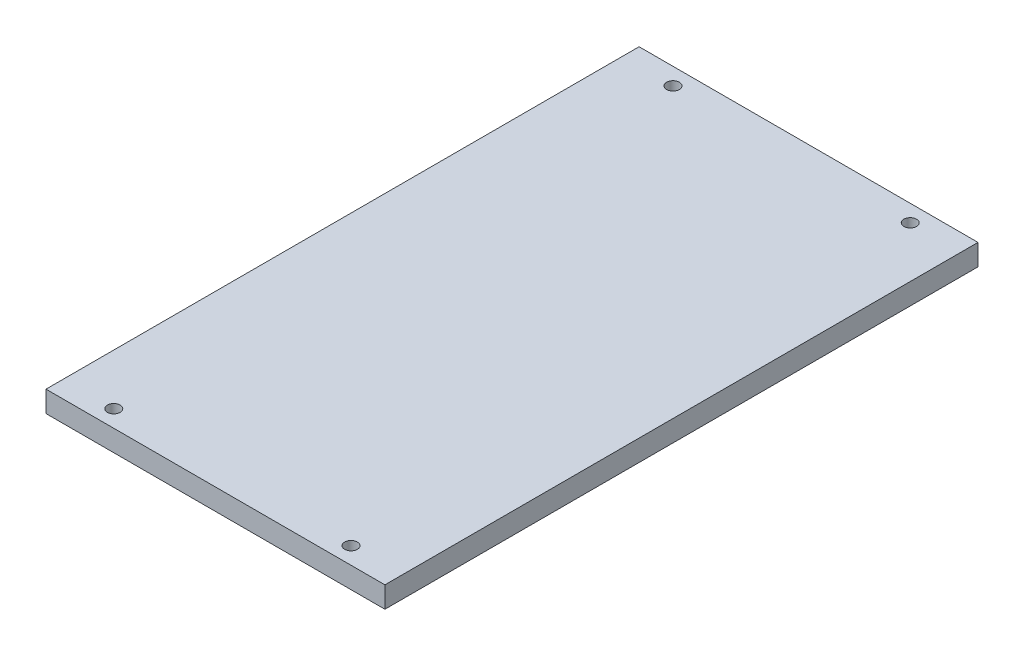
ISO-10303-21;
HEADER;
FILE_DESCRIPTION(('STEP AP214'),'2;1');
FILE_NAME('part.step','',(''),(''),'','','');
FILE_SCHEMA(('AUTOMOTIVE_DESIGN { 1 0 10303 214 1 1 1 1 }'));
ENDSEC;
DATA;
#1=APPLICATION_CONTEXT('core data for automotive mechanical design processes');
#2=APPLICATION_PROTOCOL_DEFINITION('international standard','automotive_design',2000,#1);
#3=PRODUCT_CONTEXT('',#1,'mechanical');
#4=PRODUCT('Part','Part','',(#3));
#5=PRODUCT_RELATED_PRODUCT_CATEGORY('part','',(#4));
#6=PRODUCT_DEFINITION_FORMATION('','',#4);
#7=PRODUCT_DEFINITION_CONTEXT('part definition',#1,'design');
#8=PRODUCT_DEFINITION('design','',#6,#7);
#9=PRODUCT_DEFINITION_SHAPE('','',#8);
#10=(LENGTH_UNIT() NAMED_UNIT(*) SI_UNIT(.MILLI.,.METRE.));
#11=(NAMED_UNIT(*) PLANE_ANGLE_UNIT() SI_UNIT($,.RADIAN.));
#12=(NAMED_UNIT(*) SI_UNIT($,.STERADIAN.) SOLID_ANGLE_UNIT());
#13=UNCERTAINTY_MEASURE_WITH_UNIT(LENGTH_MEASURE(1.E-05),#10,'distance_accuracy_value','');
#14=(GEOMETRIC_REPRESENTATION_CONTEXT(3) GLOBAL_UNCERTAINTY_ASSIGNED_CONTEXT((#13)) GLOBAL_UNIT_ASSIGNED_CONTEXT((#10,
#11,#12)) REPRESENTATION_CONTEXT('',''));
#15=CARTESIAN_POINT('',(0.,0.,0.));
#16=DIRECTION('',(0.,0.,1.));
#17=DIRECTION('',(1.,0.,0.));
#18=AXIS2_PLACEMENT_3D('',#15,#16,#17);
#19=CARTESIAN_POINT('',(0.,5.,0.));
#20=DIRECTION('',(0.,1.,0.));
#21=DIRECTION('',(0.,0.,1.));
#22=AXIS2_PLACEMENT_3D('',#19,#20,#21);
#23=PLANE('',#22);
#24=CARTESIAN_POINT('',(-68.,5.,-4.));
#25=DIRECTION('',(0.,-1.,0.));
#26=DIRECTION('',(0.,0.,-1.));
#27=AXIS2_PLACEMENT_3D('',#24,#25,#26);
#28=CIRCLE('',#27,1.5);
#29=CARTESIAN_POINT('',(-68.,5.,-5.5));
#30=VERTEX_POINT('',#29);
#31=EDGE_CURVE('E124',#30,#30,#28,.T.);
#32=ORIENTED_EDGE('',*,*,#31,.T.);
#33=EDGE_LOOP('',(#32));
#34=FACE_BOUND('',#33,.T.);
#35=CARTESIAN_POINT('',(-12.,5.,-136.));
#36=DIRECTION('',(0.,1.,0.));
#37=DIRECTION('',(0.,0.,1.));
#38=AXIS2_PLACEMENT_3D('',#35,#36,#37);
#39=CIRCLE('',#38,1.5);
#40=CARTESIAN_POINT('',(-12.,5.,-134.5));
#41=VERTEX_POINT('',#40);
#42=EDGE_CURVE('E118',#41,#41,#39,.T.);
#43=ORIENTED_EDGE('',*,*,#42,.F.);
#44=EDGE_LOOP('',(#43));
#45=FACE_BOUND('',#44,.T.);
#46=CARTESIAN_POINT('',(-68.,5.,-136.));
#47=DIRECTION('',(0.,1.,0.));
#48=DIRECTION('',(0.,0.,1.));
#49=AXIS2_PLACEMENT_3D('',#46,#47,#48);
#50=CIRCLE('',#49,1.5);
#51=CARTESIAN_POINT('',(-68.,5.,-134.5));
#52=VERTEX_POINT('',#51);
#53=EDGE_CURVE('E112',#52,#52,#50,.T.);
#54=ORIENTED_EDGE('',*,*,#53,.F.);
#55=EDGE_LOOP('',(#54));
#56=FACE_BOUND('',#55,.T.);
#57=DIRECTION('',(0.,0.,-1.));
#58=VECTOR('',#57,1.);
#59=CARTESIAN_POINT('',(0.,5.,0.));
#60=LINE('',#59,#58);
#61=CARTESIAN_POINT('',(0.,5.,0.));
#62=VERTEX_POINT('',#61);
#63=CARTESIAN_POINT('',(0.,5.,-140.));
#64=VERTEX_POINT('',#63);
#65=EDGE_CURVE('E85',#62,#64,#60,.T.);
#66=ORIENTED_EDGE('',*,*,#65,.T.);
#67=DIRECTION('',(-1.,0.,0.));
#68=VECTOR('',#67,1.);
#69=CARTESIAN_POINT('',(0.,5.,-140.));
#70=LINE('',#69,#68);
#71=CARTESIAN_POINT('',(-80.,5.,-140.));
#72=VERTEX_POINT('',#71);
#73=EDGE_CURVE('E80',#64,#72,#70,.T.);
#74=ORIENTED_EDGE('',*,*,#73,.T.);
#75=DIRECTION('',(0.,0.,1.));
#76=VECTOR('',#75,1.);
#77=CARTESIAN_POINT('',(-80.,5.,0.));
#78=LINE('',#77,#76);
#79=CARTESIAN_POINT('',(-80.,5.,0.));
#80=VERTEX_POINT('',#79);
#81=EDGE_CURVE('E83',#72,#80,#78,.T.);
#82=ORIENTED_EDGE('',*,*,#81,.T.);
#83=DIRECTION('',(1.,0.,0.));
#84=VECTOR('',#83,1.);
#85=CARTESIAN_POINT('',(0.,5.,0.));
#86=LINE('',#85,#84);
#87=EDGE_CURVE('E50',#80,#62,#86,.T.);
#88=ORIENTED_EDGE('',*,*,#87,.T.);
#89=EDGE_LOOP('',(#66,#74,#82,#88));
#90=FACE_BOUND('',#89,.T.);
#91=CARTESIAN_POINT('',(-12.,5.,-4.));
#92=DIRECTION('',(0.,-1.,0.));
#93=DIRECTION('',(0.,0.,-1.));
#94=AXIS2_PLACEMENT_3D('',#91,#92,#93);
#95=CIRCLE('',#94,1.5);
#96=CARTESIAN_POINT('',(-12.,5.,-5.50000000000001));
#97=VERTEX_POINT('',#96);
#98=EDGE_CURVE('E130',#97,#97,#95,.T.);
#99=ORIENTED_EDGE('',*,*,#98,.T.);
#100=EDGE_LOOP('',(#99));
#101=FACE_BOUND('',#100,.T.);
#102=ADVANCED_FACE('F33',(#34,#45,#56,#90,#101),#23,.T.);
#103=CARTESIAN_POINT('',(0.,0.,0.));
#104=DIRECTION('',(0.,1.,0.));
#105=DIRECTION('',(0.,0.,1.));
#106=AXIS2_PLACEMENT_3D('',#103,#104,#105);
#107=PLANE('',#106);
#108=CARTESIAN_POINT('',(-68.,0.,-4.));
#109=DIRECTION('',(0.,-1.,0.));
#110=DIRECTION('',(0.,0.,-1.));
#111=AXIS2_PLACEMENT_3D('',#108,#109,#110);
#112=CIRCLE('',#111,1.5);
#113=CARTESIAN_POINT('',(-68.,0.,-5.5));
#114=VERTEX_POINT('',#113);
#115=EDGE_CURVE('E121',#114,#114,#112,.T.);
#116=ORIENTED_EDGE('',*,*,#115,.F.);
#117=EDGE_LOOP('',(#116));
#118=FACE_BOUND('',#117,.T.);
#119=CARTESIAN_POINT('',(-12.,0.,-136.));
#120=DIRECTION('',(0.,1.,0.));
#121=DIRECTION('',(0.,0.,1.));
#122=AXIS2_PLACEMENT_3D('',#119,#120,#121);
#123=CIRCLE('',#122,1.5);
#124=CARTESIAN_POINT('',(-12.,0.,-134.5));
#125=VERTEX_POINT('',#124);
#126=EDGE_CURVE('E115',#125,#125,#123,.T.);
#127=ORIENTED_EDGE('',*,*,#126,.T.);
#128=EDGE_LOOP('',(#127));
#129=FACE_BOUND('',#128,.T.);
#130=CARTESIAN_POINT('',(-68.,0.,-136.));
#131=DIRECTION('',(0.,1.,0.));
#132=DIRECTION('',(0.,0.,1.));
#133=AXIS2_PLACEMENT_3D('',#130,#131,#132);
#134=CIRCLE('',#133,1.5);
#135=CARTESIAN_POINT('',(-68.,0.,-134.5));
#136=VERTEX_POINT('',#135);
#137=EDGE_CURVE('E100',#136,#136,#134,.T.);
#138=ORIENTED_EDGE('',*,*,#137,.T.);
#139=EDGE_LOOP('',(#138));
#140=FACE_BOUND('',#139,.T.);
#141=DIRECTION('',(0.,0.,-1.));
#142=VECTOR('',#141,1.);
#143=CARTESIAN_POINT('',(0.,0.,0.));
#144=LINE('',#143,#142);
#145=CARTESIAN_POINT('',(0.,0.,0.));
#146=VERTEX_POINT('',#145);
#147=CARTESIAN_POINT('',(0.,0.,-140.));
#148=VERTEX_POINT('',#147);
#149=EDGE_CURVE('E97',#146,#148,#144,.T.);
#150=ORIENTED_EDGE('',*,*,#149,.F.);
#151=DIRECTION('',(1.,0.,0.));
#152=VECTOR('',#151,1.);
#153=CARTESIAN_POINT('',(0.,0.,0.));
#154=LINE('',#153,#152);
#155=CARTESIAN_POINT('',(-80.,0.,0.));
#156=VERTEX_POINT('',#155);
#157=EDGE_CURVE('E73',#156,#146,#154,.T.);
#158=ORIENTED_EDGE('',*,*,#157,.F.);
#159=DIRECTION('',(0.,0.,1.));
#160=VECTOR('',#159,1.);
#161=CARTESIAN_POINT('',(-80.,0.,0.));
#162=LINE('',#161,#160);
#163=CARTESIAN_POINT('',(-80.,0.,-140.));
#164=VERTEX_POINT('',#163);
#165=EDGE_CURVE('E67',#164,#156,#162,.T.);
#166=ORIENTED_EDGE('',*,*,#165,.F.);
#167=DIRECTION('',(-1.,0.,0.));
#168=VECTOR('',#167,1.);
#169=CARTESIAN_POINT('',(0.,0.,-140.));
#170=LINE('',#169,#168);
#171=EDGE_CURVE('E89',#148,#164,#170,.T.);
#172=ORIENTED_EDGE('',*,*,#171,.F.);
#173=EDGE_LOOP('',(#150,#158,#166,#172));
#174=FACE_BOUND('',#173,.T.);
#175=CARTESIAN_POINT('',(-12.,0.,-4.));
#176=DIRECTION('',(0.,-1.,0.));
#177=DIRECTION('',(0.,0.,-1.));
#178=AXIS2_PLACEMENT_3D('',#175,#176,#177);
#179=CIRCLE('',#178,1.5);
#180=CARTESIAN_POINT('',(-12.,0.,-5.50000000000001));
#181=VERTEX_POINT('',#180);
#182=EDGE_CURVE('E127',#181,#181,#179,.T.);
#183=ORIENTED_EDGE('',*,*,#182,.F.);
#184=EDGE_LOOP('',(#183));
#185=FACE_BOUND('',#184,.T.);
#186=ADVANCED_FACE('F108',(#118,#129,#140,#174,#185),#107,.F.);
#187=CARTESIAN_POINT('',(0.,5.,0.));
#188=DIRECTION('',(-1.,0.,0.));
#189=DIRECTION('',(0.,0.,1.));
#190=AXIS2_PLACEMENT_3D('',#187,#188,#189);
#191=PLANE('',#190);
#192=ORIENTED_EDGE('',*,*,#149,.T.);
#193=DIRECTION('',(0.,-1.,0.));
#194=VECTOR('',#193,1.);
#195=CARTESIAN_POINT('',(0.,5.,-140.));
#196=LINE('',#195,#194);
#197=EDGE_CURVE('E11',#64,#148,#196,.T.);
#198=ORIENTED_EDGE('',*,*,#197,.F.);
#199=ORIENTED_EDGE('',*,*,#65,.F.);
#200=DIRECTION('',(0.,-1.,0.));
#201=VECTOR('',#200,1.);
#202=CARTESIAN_POINT('',(0.,5.,0.));
#203=LINE('',#202,#201);
#204=EDGE_CURVE('E93',#62,#146,#203,.T.);
#205=ORIENTED_EDGE('',*,*,#204,.T.);
#206=EDGE_LOOP('',(#192,#198,#199,#205));
#207=FACE_BOUND('',#206,.T.);
#208=ADVANCED_FACE('F35',(#207),#191,.F.);
#209=CARTESIAN_POINT('',(0.,5.,-140.));
#210=DIRECTION('',(0.,0.,1.));
#211=DIRECTION('',(1.,0.,0.));
#212=AXIS2_PLACEMENT_3D('',#209,#210,#211);
#213=PLANE('',#212);
#214=ORIENTED_EDGE('',*,*,#171,.T.);
#215=DIRECTION('',(0.,-1.,0.));
#216=VECTOR('',#215,1.);
#217=CARTESIAN_POINT('',(-80.,5.,-140.));
#218=LINE('',#217,#216);
#219=EDGE_CURVE('E42',#72,#164,#218,.T.);
#220=ORIENTED_EDGE('',*,*,#219,.F.);
#221=ORIENTED_EDGE('',*,*,#73,.F.);
#222=ORIENTED_EDGE('',*,*,#197,.T.);
#223=EDGE_LOOP('',(#214,#220,#221,#222));
#224=FACE_BOUND('',#223,.T.);
#225=ADVANCED_FACE('F88',(#224),#213,.F.);
#226=CARTESIAN_POINT('',(-80.,5.,0.));
#227=DIRECTION('',(1.,0.,0.));
#228=DIRECTION('',(0.,0.,-1.));
#229=AXIS2_PLACEMENT_3D('',#226,#227,#228);
#230=PLANE('',#229);
#231=ORIENTED_EDGE('',*,*,#165,.T.);
#232=DIRECTION('',(0.,-1.,0.));
#233=VECTOR('',#232,1.);
#234=CARTESIAN_POINT('',(-80.,5.,0.));
#235=LINE('',#234,#233);
#236=EDGE_CURVE('E90',#80,#156,#235,.T.);
#237=ORIENTED_EDGE('',*,*,#236,.F.);
#238=ORIENTED_EDGE('',*,*,#81,.F.);
#239=ORIENTED_EDGE('',*,*,#219,.T.);
#240=EDGE_LOOP('',(#231,#237,#238,#239));
#241=FACE_BOUND('',#240,.T.);
#242=ADVANCED_FACE('F91',(#241),#230,.F.);
#243=CARTESIAN_POINT('',(0.,5.,0.));
#244=DIRECTION('',(0.,0.,-1.));
#245=DIRECTION('',(-1.,0.,0.));
#246=AXIS2_PLACEMENT_3D('',#243,#244,#245);
#247=PLANE('',#246);
#248=ORIENTED_EDGE('',*,*,#157,.T.);
#249=ORIENTED_EDGE('',*,*,#204,.F.);
#250=ORIENTED_EDGE('',*,*,#87,.F.);
#251=ORIENTED_EDGE('',*,*,#236,.T.);
#252=EDGE_LOOP('',(#248,#249,#250,#251));
#253=FACE_BOUND('',#252,.T.);
#254=ADVANCED_FACE('F105',(#253),#247,.F.);
#255=CARTESIAN_POINT('',(-68.,0.,-136.));
#256=DIRECTION('',(0.,1.,0.));
#257=DIRECTION('',(0.,0.,1.));
#258=AXIS2_PLACEMENT_3D('',#255,#256,#257);
#259=CYLINDRICAL_SURFACE('',#258,1.5);
#260=ORIENTED_EDGE('',*,*,#137,.F.);
#261=EDGE_LOOP('',(#260));
#262=FACE_BOUND('',#261,.T.);
#263=ORIENTED_EDGE('',*,*,#53,.T.);
#264=EDGE_LOOP('',(#263));
#265=FACE_BOUND('',#264,.T.);
#266=ADVANCED_FACE('F153',(#262,#265),#259,.F.);
#267=CARTESIAN_POINT('',(-12.,0.,-136.));
#268=DIRECTION('',(0.,1.,0.));
#269=DIRECTION('',(0.,0.,1.));
#270=AXIS2_PLACEMENT_3D('',#267,#268,#269);
#271=CYLINDRICAL_SURFACE('',#270,1.5);
#272=ORIENTED_EDGE('',*,*,#126,.F.);
#273=EDGE_LOOP('',(#272));
#274=FACE_BOUND('',#273,.T.);
#275=ORIENTED_EDGE('',*,*,#42,.T.);
#276=EDGE_LOOP('',(#275));
#277=FACE_BOUND('',#276,.T.);
#278=ADVANCED_FACE('F174',(#274,#277),#271,.F.);
#279=CARTESIAN_POINT('',(-68.,0.,-4.));
#280=DIRECTION('',(0.,1.,0.));
#281=DIRECTION('',(0.,0.,1.));
#282=AXIS2_PLACEMENT_3D('',#279,#280,#281);
#283=CYLINDRICAL_SURFACE('',#282,1.5);
#284=ORIENTED_EDGE('',*,*,#115,.T.);
#285=EDGE_LOOP('',(#284));
#286=FACE_BOUND('',#285,.T.);
#287=ORIENTED_EDGE('',*,*,#31,.F.);
#288=EDGE_LOOP('',(#287));
#289=FACE_BOUND('',#288,.T.);
#290=ADVANCED_FACE('F181',(#286,#289),#283,.F.);
#291=CARTESIAN_POINT('',(-12.,0.,-4.));
#292=DIRECTION('',(0.,1.,0.));
#293=DIRECTION('',(0.,0.,1.));
#294=AXIS2_PLACEMENT_3D('',#291,#292,#293);
#295=CYLINDRICAL_SURFACE('',#294,1.5);
#296=ORIENTED_EDGE('',*,*,#182,.T.);
#297=EDGE_LOOP('',(#296));
#298=FACE_BOUND('',#297,.T.);
#299=ORIENTED_EDGE('',*,*,#98,.F.);
#300=EDGE_LOOP('',(#299));
#301=FACE_BOUND('',#300,.T.);
#302=ADVANCED_FACE('F136',(#298,#301),#295,.F.);
#303=CLOSED_SHELL('',(#102,#186,#208,#225,#242,#254,#266,#278,#290,#302));
#304=MANIFOLD_SOLID_BREP('B2',#303);
#305=ADVANCED_BREP_SHAPE_REPRESENTATION('',(#18,#304),#14);
#306=SHAPE_DEFINITION_REPRESENTATION(#9,#305);
ENDSEC;
END-ISO-10303-21;
